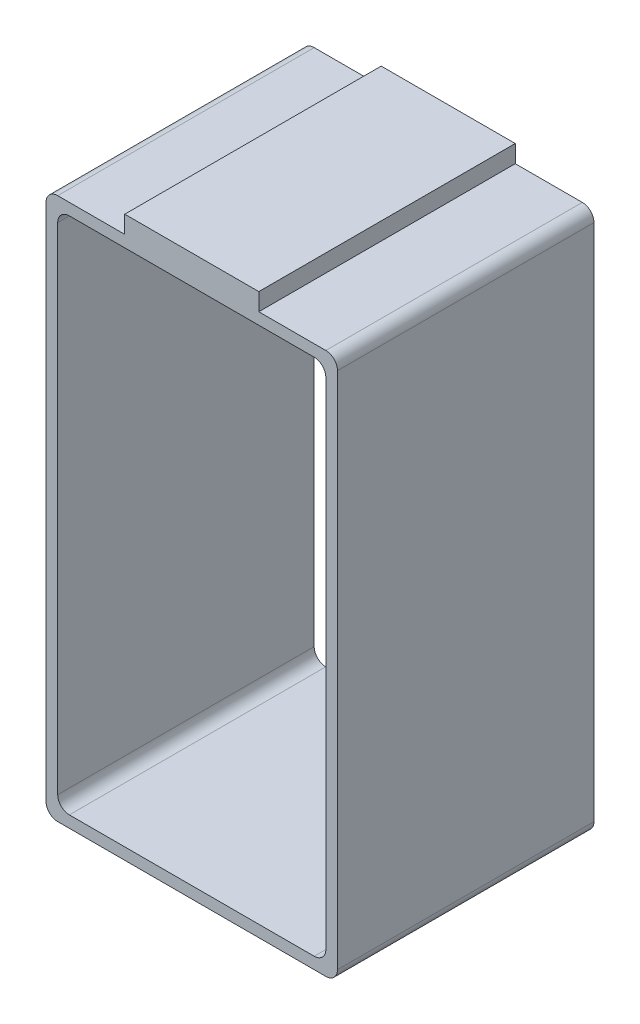
ISO-10303-21;
HEADER;
FILE_DESCRIPTION(('STEP AP214'),'2;1');
FILE_NAME('part.step','',(''),(''),'','','');
FILE_SCHEMA(('AUTOMOTIVE_DESIGN { 1 0 10303 214 1 1 1 1 }'));
ENDSEC;
DATA;
#1=APPLICATION_CONTEXT('core data for automotive mechanical design processes');
#2=APPLICATION_PROTOCOL_DEFINITION('international standard','automotive_design',2000,#1);
#3=PRODUCT_CONTEXT('',#1,'mechanical');
#4=PRODUCT('Part','Part','',(#3));
#5=PRODUCT_RELATED_PRODUCT_CATEGORY('part','',(#4));
#6=PRODUCT_DEFINITION_FORMATION('','',#4);
#7=PRODUCT_DEFINITION_CONTEXT('part definition',#1,'design');
#8=PRODUCT_DEFINITION('design','',#6,#7);
#9=PRODUCT_DEFINITION_SHAPE('','',#8);
#10=(LENGTH_UNIT() NAMED_UNIT(*) SI_UNIT(.MILLI.,.METRE.));
#11=(NAMED_UNIT(*) PLANE_ANGLE_UNIT() SI_UNIT($,.RADIAN.));
#12=(NAMED_UNIT(*) SI_UNIT($,.STERADIAN.) SOLID_ANGLE_UNIT());
#13=UNCERTAINTY_MEASURE_WITH_UNIT(LENGTH_MEASURE(1.E-05),#10,'distance_accuracy_value','');
#14=(GEOMETRIC_REPRESENTATION_CONTEXT(3) GLOBAL_UNCERTAINTY_ASSIGNED_CONTEXT((#13)) GLOBAL_UNIT_ASSIGNED_CONTEXT((#10,
#11,#12)) REPRESENTATION_CONTEXT('',''));
#15=CARTESIAN_POINT('',(0.,0.,0.));
#16=DIRECTION('',(0.,0.,1.));
#17=DIRECTION('',(1.,0.,0.));
#18=AXIS2_PLACEMENT_3D('',#15,#16,#17);
#19=CARTESIAN_POINT('',(24.,-45.5,22.));
#20=DIRECTION('',(0.,0.,-1.));
#21=DIRECTION('',(-1.,0.,0.));
#22=AXIS2_PLACEMENT_3D('',#19,#20,#21);
#23=CYLINDRICAL_SURFACE('',#22,1.);
#24=CARTESIAN_POINT('',(24.,-45.5,0.));
#25=DIRECTION('',(0.,0.,1.));
#26=DIRECTION('',(1.,0.,0.));
#27=AXIS2_PLACEMENT_3D('',#24,#25,#26);
#28=CIRCLE('',#27,1.);
#29=CARTESIAN_POINT('',(24.,-46.5,0.));
#30=VERTEX_POINT('',#29);
#31=CARTESIAN_POINT('',(25.,-45.5,0.));
#32=VERTEX_POINT('',#31);
#33=EDGE_CURVE('E230',#30,#32,#28,.T.);
#34=ORIENTED_EDGE('',*,*,#33,.T.);
#35=DIRECTION('',(0.,0.,-1.));
#36=VECTOR('',#35,1.);
#37=CARTESIAN_POINT('',(25.,-45.5,22.));
#38=LINE('',#37,#36);
#39=CARTESIAN_POINT('',(25.,-45.5,22.));
#40=VERTEX_POINT('',#39);
#41=EDGE_CURVE('E11',#40,#32,#38,.T.);
#42=ORIENTED_EDGE('',*,*,#41,.F.);
#43=CARTESIAN_POINT('',(24.,-45.5,22.));
#44=DIRECTION('',(0.,0.,1.));
#45=DIRECTION('',(1.,0.,0.));
#46=AXIS2_PLACEMENT_3D('',#43,#44,#45);
#47=CIRCLE('',#46,1.);
#48=CARTESIAN_POINT('',(24.,-46.5,22.));
#49=VERTEX_POINT('',#48);
#50=EDGE_CURVE('E242',#49,#40,#47,.T.);
#51=ORIENTED_EDGE('',*,*,#50,.F.);
#52=DIRECTION('',(0.,0.,-1.));
#53=VECTOR('',#52,1.);
#54=CARTESIAN_POINT('',(24.,-46.5,22.));
#55=LINE('',#54,#53);
#56=EDGE_CURVE('E268',#49,#30,#55,.T.);
#57=ORIENTED_EDGE('',*,*,#56,.T.);
#58=EDGE_LOOP('',(#34,#42,#51,#57));
#59=FACE_BOUND('',#58,.T.);
#60=ADVANCED_FACE('F37',(#59),#23,.T.);
#61=CARTESIAN_POINT('',(25.,-1.00000000000001,22.));
#62=DIRECTION('',(-1.,0.,0.));
#63=DIRECTION('',(0.,-1.,0.));
#64=AXIS2_PLACEMENT_3D('',#61,#62,#63);
#65=PLANE('',#64);
#66=DIRECTION('',(0.,1.,0.));
#67=VECTOR('',#66,1.);
#68=CARTESIAN_POINT('',(25.,-1.00000000000001,0.));
#69=LINE('',#68,#67);
#70=CARTESIAN_POINT('',(25.,-1.00000000000001,0.));
#71=VERTEX_POINT('',#70);
#72=EDGE_CURVE('E271',#32,#71,#69,.T.);
#73=ORIENTED_EDGE('',*,*,#72,.T.);
#74=DIRECTION('',(0.,0.,-1.));
#75=VECTOR('',#74,1.);
#76=CARTESIAN_POINT('',(25.,-1.00000000000001,22.));
#77=LINE('',#76,#75);
#78=CARTESIAN_POINT('',(25.,-1.00000000000001,22.));
#79=VERTEX_POINT('',#78);
#80=EDGE_CURVE('E44',#79,#71,#77,.T.);
#81=ORIENTED_EDGE('',*,*,#80,.F.);
#82=DIRECTION('',(0.,1.,0.));
#83=VECTOR('',#82,1.);
#84=CARTESIAN_POINT('',(25.,-1.00000000000001,22.));
#85=LINE('',#84,#83);
#86=EDGE_CURVE('E245',#40,#79,#85,.T.);
#87=ORIENTED_EDGE('',*,*,#86,.F.);
#88=ORIENTED_EDGE('',*,*,#41,.T.);
#89=EDGE_LOOP('',(#73,#81,#87,#88));
#90=FACE_BOUND('',#89,.T.);
#91=ADVANCED_FACE('F346',(#90),#65,.F.);
#92=CARTESIAN_POINT('',(24.,-1.,22.));
#93=DIRECTION('',(0.,0.,-1.));
#94=DIRECTION('',(-1.,0.,0.));
#95=AXIS2_PLACEMENT_3D('',#92,#93,#94);
#96=CYLINDRICAL_SURFACE('',#95,1.);
#97=CARTESIAN_POINT('',(24.,-1.,0.));
#98=DIRECTION('',(0.,0.,1.));
#99=DIRECTION('',(1.,0.,0.));
#100=AXIS2_PLACEMENT_3D('',#97,#98,#99);
#101=CIRCLE('',#100,1.);
#102=CARTESIAN_POINT('',(24.,0.,0.));
#103=VERTEX_POINT('',#102);
#104=EDGE_CURVE('E273',#71,#103,#101,.T.);
#105=ORIENTED_EDGE('',*,*,#104,.T.);
#106=DIRECTION('',(0.,0.,-1.));
#107=VECTOR('',#106,1.);
#108=CARTESIAN_POINT('',(24.,0.,22.));
#109=LINE('',#108,#107);
#110=CARTESIAN_POINT('',(24.,0.,22.));
#111=VERTEX_POINT('',#110);
#112=EDGE_CURVE('E318',#111,#103,#109,.T.);
#113=ORIENTED_EDGE('',*,*,#112,.F.);
#114=CARTESIAN_POINT('',(24.,-1.,22.));
#115=DIRECTION('',(0.,0.,1.));
#116=DIRECTION('',(1.,0.,0.));
#117=AXIS2_PLACEMENT_3D('',#114,#115,#116);
#118=CIRCLE('',#117,1.);
#119=EDGE_CURVE('E248',#79,#111,#118,.T.);
#120=ORIENTED_EDGE('',*,*,#119,.F.);
#121=ORIENTED_EDGE('',*,*,#80,.T.);
#122=EDGE_LOOP('',(#105,#113,#120,#121));
#123=FACE_BOUND('',#122,.T.);
#124=ADVANCED_FACE('F325',(#123),#96,.T.);
#125=CARTESIAN_POINT('',(18.25,0.,22.));
#126=DIRECTION('',(0.,-1.,0.));
#127=DIRECTION('',(0.,0.,-1.));
#128=AXIS2_PLACEMENT_3D('',#125,#126,#127);
#129=PLANE('',#128);
#130=DIRECTION('',(-1.,0.,0.));
#131=VECTOR('',#130,1.);
#132=CARTESIAN_POINT('',(18.25,0.,0.));
#133=LINE('',#132,#131);
#134=CARTESIAN_POINT('',(18.25,0.,0.));
#135=VERTEX_POINT('',#134);
#136=EDGE_CURVE('E275',#103,#135,#133,.T.);
#137=ORIENTED_EDGE('',*,*,#136,.T.);
#138=DIRECTION('',(0.,0.,-1.));
#139=VECTOR('',#138,1.);
#140=CARTESIAN_POINT('',(18.25,0.,22.));
#141=LINE('',#140,#139);
#142=CARTESIAN_POINT('',(18.25,0.,22.));
#143=VERTEX_POINT('',#142);
#144=EDGE_CURVE('E315',#143,#135,#141,.T.);
#145=ORIENTED_EDGE('',*,*,#144,.F.);
#146=DIRECTION('',(-1.,0.,0.));
#147=VECTOR('',#146,1.);
#148=CARTESIAN_POINT('',(18.25,0.,22.));
#149=LINE('',#148,#147);
#150=EDGE_CURVE('E250',#111,#143,#149,.T.);
#151=ORIENTED_EDGE('',*,*,#150,.F.);
#152=ORIENTED_EDGE('',*,*,#112,.T.);
#153=EDGE_LOOP('',(#137,#145,#151,#152));
#154=FACE_BOUND('',#153,.T.);
#155=ADVANCED_FACE('F334',(#154),#129,.F.);
#156=CARTESIAN_POINT('',(18.25,1.5,22.));
#157=DIRECTION('',(-1.,0.,0.));
#158=DIRECTION('',(0.,0.,1.));
#159=AXIS2_PLACEMENT_3D('',#156,#157,#158);
#160=PLANE('',#159);
#161=DIRECTION('',(0.,1.,0.));
#162=VECTOR('',#161,1.);
#163=CARTESIAN_POINT('',(18.25,1.5,0.));
#164=LINE('',#163,#162);
#165=CARTESIAN_POINT('',(18.25,1.5,0.));
#166=VERTEX_POINT('',#165);
#167=EDGE_CURVE('E277',#135,#166,#164,.T.);
#168=ORIENTED_EDGE('',*,*,#167,.T.);
#169=DIRECTION('',(0.,0.,-1.));
#170=VECTOR('',#169,1.);
#171=CARTESIAN_POINT('',(18.25,1.5,22.));
#172=LINE('',#171,#170);
#173=CARTESIAN_POINT('',(18.25,1.5,22.));
#174=VERTEX_POINT('',#173);
#175=EDGE_CURVE('E312',#174,#166,#172,.T.);
#176=ORIENTED_EDGE('',*,*,#175,.F.);
#177=DIRECTION('',(0.,1.,0.));
#178=VECTOR('',#177,1.);
#179=CARTESIAN_POINT('',(18.25,1.5,22.));
#180=LINE('',#179,#178);
#181=EDGE_CURVE('E252',#143,#174,#180,.T.);
#182=ORIENTED_EDGE('',*,*,#181,.F.);
#183=ORIENTED_EDGE('',*,*,#144,.T.);
#184=EDGE_LOOP('',(#168,#176,#182,#183));
#185=FACE_BOUND('',#184,.T.);
#186=ADVANCED_FACE('F338',(#185),#160,.F.);
#187=CARTESIAN_POINT('',(6.75,1.5,22.));
#188=DIRECTION('',(0.,-1.,0.));
#189=DIRECTION('',(0.,0.,-1.));
#190=AXIS2_PLACEMENT_3D('',#187,#188,#189);
#191=PLANE('',#190);
#192=DIRECTION('',(-1.,0.,0.));
#193=VECTOR('',#192,1.);
#194=CARTESIAN_POINT('',(6.75,1.5,0.));
#195=LINE('',#194,#193);
#196=CARTESIAN_POINT('',(6.75,1.5,0.));
#197=VERTEX_POINT('',#196);
#198=EDGE_CURVE('E279',#166,#197,#195,.T.);
#199=ORIENTED_EDGE('',*,*,#198,.T.);
#200=DIRECTION('',(0.,0.,-1.));
#201=VECTOR('',#200,1.);
#202=CARTESIAN_POINT('',(6.75,1.5,22.));
#203=LINE('',#202,#201);
#204=CARTESIAN_POINT('',(6.75,1.5,22.));
#205=VERTEX_POINT('',#204);
#206=EDGE_CURVE('E309',#205,#197,#203,.T.);
#207=ORIENTED_EDGE('',*,*,#206,.F.);
#208=DIRECTION('',(-1.,0.,0.));
#209=VECTOR('',#208,1.);
#210=CARTESIAN_POINT('',(6.75,1.5,22.));
#211=LINE('',#210,#209);
#212=EDGE_CURVE('E254',#174,#205,#211,.T.);
#213=ORIENTED_EDGE('',*,*,#212,.F.);
#214=ORIENTED_EDGE('',*,*,#175,.T.);
#215=EDGE_LOOP('',(#199,#207,#213,#214));
#216=FACE_BOUND('',#215,.T.);
#217=ADVANCED_FACE('F379',(#216),#191,.F.);
#218=CARTESIAN_POINT('',(6.75,1.5,22.));
#219=DIRECTION('',(1.,0.,0.));
#220=DIRECTION('',(0.,0.,-1.));
#221=AXIS2_PLACEMENT_3D('',#218,#219,#220);
#222=PLANE('',#221);
#223=DIRECTION('',(0.,-1.,0.));
#224=VECTOR('',#223,1.);
#225=CARTESIAN_POINT('',(6.75,1.5,0.));
#226=LINE('',#225,#224);
#227=CARTESIAN_POINT('',(6.75,0.,0.));
#228=VERTEX_POINT('',#227);
#229=EDGE_CURVE('E281',#197,#228,#226,.T.);
#230=ORIENTED_EDGE('',*,*,#229,.T.);
#231=DIRECTION('',(0.,0.,-1.));
#232=VECTOR('',#231,1.);
#233=CARTESIAN_POINT('',(6.75,0.,22.));
#234=LINE('',#233,#232);
#235=CARTESIAN_POINT('',(6.75,0.,22.));
#236=VERTEX_POINT('',#235);
#237=EDGE_CURVE('E306',#236,#228,#234,.T.);
#238=ORIENTED_EDGE('',*,*,#237,.F.);
#239=DIRECTION('',(0.,-1.,0.));
#240=VECTOR('',#239,1.);
#241=CARTESIAN_POINT('',(6.75,1.5,22.));
#242=LINE('',#241,#240);
#243=EDGE_CURVE('E256',#205,#236,#242,.T.);
#244=ORIENTED_EDGE('',*,*,#243,.F.);
#245=ORIENTED_EDGE('',*,*,#206,.T.);
#246=EDGE_LOOP('',(#230,#238,#244,#245));
#247=FACE_BOUND('',#246,.T.);
#248=ADVANCED_FACE('F377',(#247),#222,.F.);
#249=CARTESIAN_POINT('',(1.00000000000001,0.,22.));
#250=DIRECTION('',(0.,-1.,0.));
#251=DIRECTION('',(0.,0.,-1.));
#252=AXIS2_PLACEMENT_3D('',#249,#250,#251);
#253=PLANE('',#252);
#254=DIRECTION('',(-1.,0.,0.));
#255=VECTOR('',#254,1.);
#256=CARTESIAN_POINT('',(1.00000000000001,0.,0.));
#257=LINE('',#256,#255);
#258=CARTESIAN_POINT('',(1.00000000000001,0.,0.));
#259=VERTEX_POINT('',#258);
#260=EDGE_CURVE('E283',#228,#259,#257,.T.);
#261=ORIENTED_EDGE('',*,*,#260,.T.);
#262=DIRECTION('',(0.,0.,-1.));
#263=VECTOR('',#262,1.);
#264=CARTESIAN_POINT('',(1.00000000000001,0.,22.));
#265=LINE('',#264,#263);
#266=CARTESIAN_POINT('',(1.00000000000001,0.,22.));
#267=VERTEX_POINT('',#266);
#268=EDGE_CURVE('E303',#267,#259,#265,.T.);
#269=ORIENTED_EDGE('',*,*,#268,.F.);
#270=DIRECTION('',(-1.,0.,0.));
#271=VECTOR('',#270,1.);
#272=CARTESIAN_POINT('',(1.00000000000001,0.,22.));
#273=LINE('',#272,#271);
#274=EDGE_CURVE('E258',#236,#267,#273,.T.);
#275=ORIENTED_EDGE('',*,*,#274,.F.);
#276=ORIENTED_EDGE('',*,*,#237,.T.);
#277=EDGE_LOOP('',(#261,#269,#275,#276));
#278=FACE_BOUND('',#277,.T.);
#279=ADVANCED_FACE('F373',(#278),#253,.F.);
#280=CARTESIAN_POINT('',(1.,-1.,22.));
#281=DIRECTION('',(0.,0.,-1.));
#282=DIRECTION('',(-1.,0.,0.));
#283=AXIS2_PLACEMENT_3D('',#280,#281,#282);
#284=CYLINDRICAL_SURFACE('',#283,1.);
#285=CARTESIAN_POINT('',(1.,-1.,0.));
#286=DIRECTION('',(0.,0.,1.));
#287=DIRECTION('',(-1.,0.,0.));
#288=AXIS2_PLACEMENT_3D('',#285,#286,#287);
#289=CIRCLE('',#288,1.);
#290=CARTESIAN_POINT('',(0.,-1.00000000000001,0.));
#291=VERTEX_POINT('',#290);
#292=EDGE_CURVE('E285',#259,#291,#289,.T.);
#293=ORIENTED_EDGE('',*,*,#292,.T.);
#294=DIRECTION('',(0.,0.,-1.));
#295=VECTOR('',#294,1.);
#296=CARTESIAN_POINT('',(0.,-1.00000000000001,22.));
#297=LINE('',#296,#295);
#298=CARTESIAN_POINT('',(0.,-1.00000000000001,22.));
#299=VERTEX_POINT('',#298);
#300=EDGE_CURVE('E300',#299,#291,#297,.T.);
#301=ORIENTED_EDGE('',*,*,#300,.F.);
#302=CARTESIAN_POINT('',(1.,-1.,22.));
#303=DIRECTION('',(0.,0.,1.));
#304=DIRECTION('',(-1.,0.,0.));
#305=AXIS2_PLACEMENT_3D('',#302,#303,#304);
#306=CIRCLE('',#305,1.);
#307=EDGE_CURVE('E260',#267,#299,#306,.T.);
#308=ORIENTED_EDGE('',*,*,#307,.F.);
#309=ORIENTED_EDGE('',*,*,#268,.T.);
#310=EDGE_LOOP('',(#293,#301,#308,#309));
#311=FACE_BOUND('',#310,.T.);
#312=ADVANCED_FACE('F368',(#311),#284,.T.);
#313=CARTESIAN_POINT('',(0.,-1.00000000000001,22.));
#314=DIRECTION('',(1.,0.,0.));
#315=DIRECTION('',(0.,1.,0.));
#316=AXIS2_PLACEMENT_3D('',#313,#314,#315);
#317=PLANE('',#316);
#318=DIRECTION('',(0.,-1.,0.));
#319=VECTOR('',#318,1.);
#320=CARTESIAN_POINT('',(0.,-1.00000000000001,0.));
#321=LINE('',#320,#319);
#322=CARTESIAN_POINT('',(0.,-45.5,0.));
#323=VERTEX_POINT('',#322);
#324=EDGE_CURVE('E287',#291,#323,#321,.T.);
#325=ORIENTED_EDGE('',*,*,#324,.T.);
#326=DIRECTION('',(0.,0.,-1.));
#327=VECTOR('',#326,1.);
#328=CARTESIAN_POINT('',(0.,-45.5,22.));
#329=LINE('',#328,#327);
#330=CARTESIAN_POINT('',(0.,-45.5,22.));
#331=VERTEX_POINT('',#330);
#332=EDGE_CURVE('E297',#331,#323,#329,.T.);
#333=ORIENTED_EDGE('',*,*,#332,.F.);
#334=DIRECTION('',(0.,-1.,0.));
#335=VECTOR('',#334,1.);
#336=CARTESIAN_POINT('',(0.,-1.00000000000001,22.));
#337=LINE('',#336,#335);
#338=EDGE_CURVE('E262',#299,#331,#337,.T.);
#339=ORIENTED_EDGE('',*,*,#338,.F.);
#340=ORIENTED_EDGE('',*,*,#300,.T.);
#341=EDGE_LOOP('',(#325,#333,#339,#340));
#342=FACE_BOUND('',#341,.T.);
#343=ADVANCED_FACE('F362',(#342),#317,.F.);
#344=CARTESIAN_POINT('',(1.00000000000001,-45.5,22.));
#345=DIRECTION('',(0.,0.,-1.));
#346=DIRECTION('',(-1.,0.,0.));
#347=AXIS2_PLACEMENT_3D('',#344,#345,#346);
#348=CYLINDRICAL_SURFACE('',#347,1.);
#349=CARTESIAN_POINT('',(1.00000000000001,-45.5,0.));
#350=DIRECTION('',(0.,0.,1.));
#351=DIRECTION('',(-1.,0.,0.));
#352=AXIS2_PLACEMENT_3D('',#349,#350,#351);
#353=CIRCLE('',#352,1.);
#354=CARTESIAN_POINT('',(1.00000000000001,-46.5,0.));
#355=VERTEX_POINT('',#354);
#356=EDGE_CURVE('E289',#323,#355,#353,.T.);
#357=ORIENTED_EDGE('',*,*,#356,.T.);
#358=DIRECTION('',(0.,0.,-1.));
#359=VECTOR('',#358,1.);
#360=CARTESIAN_POINT('',(1.00000000000001,-46.5,22.));
#361=LINE('',#360,#359);
#362=CARTESIAN_POINT('',(1.00000000000001,-46.5,22.));
#363=VERTEX_POINT('',#362);
#364=EDGE_CURVE('E294',#363,#355,#361,.T.);
#365=ORIENTED_EDGE('',*,*,#364,.F.);
#366=CARTESIAN_POINT('',(1.00000000000001,-45.5,22.));
#367=DIRECTION('',(0.,0.,1.));
#368=DIRECTION('',(-1.,0.,0.));
#369=AXIS2_PLACEMENT_3D('',#366,#367,#368);
#370=CIRCLE('',#369,1.);
#371=EDGE_CURVE('E264',#331,#363,#370,.T.);
#372=ORIENTED_EDGE('',*,*,#371,.F.);
#373=ORIENTED_EDGE('',*,*,#332,.T.);
#374=EDGE_LOOP('',(#357,#365,#372,#373));
#375=FACE_BOUND('',#374,.T.);
#376=ADVANCED_FACE('F358',(#375),#348,.T.);
#377=CARTESIAN_POINT('',(1.00000000000001,-46.5,22.));
#378=DIRECTION('',(0.,1.,0.));
#379=DIRECTION('',(0.,0.,1.));
#380=AXIS2_PLACEMENT_3D('',#377,#378,#379);
#381=PLANE('',#380);
#382=DIRECTION('',(1.,0.,0.));
#383=VECTOR('',#382,1.);
#384=CARTESIAN_POINT('',(1.00000000000001,-46.5,0.));
#385=LINE('',#384,#383);
#386=EDGE_CURVE('E246',#355,#30,#385,.T.);
#387=ORIENTED_EDGE('',*,*,#386,.T.);
#388=ORIENTED_EDGE('',*,*,#56,.F.);
#389=DIRECTION('',(1.,0.,0.));
#390=VECTOR('',#389,1.);
#391=CARTESIAN_POINT('',(1.00000000000001,-46.5,22.));
#392=LINE('',#391,#390);
#393=EDGE_CURVE('E266',#363,#49,#392,.T.);
#394=ORIENTED_EDGE('',*,*,#393,.F.);
#395=ORIENTED_EDGE('',*,*,#364,.T.);
#396=EDGE_LOOP('',(#387,#388,#394,#395));
#397=FACE_BOUND('',#396,.T.);
#398=ADVANCED_FACE('F353',(#397),#381,.F.);
#399=CARTESIAN_POINT('',(24.,-45.5,22.));
#400=DIRECTION('',(0.,0.,1.));
#401=DIRECTION('',(1.,0.,0.));
#402=AXIS2_PLACEMENT_3D('',#399,#400,#401);
#403=PLANE('',#402);
#404=CARTESIAN_POINT('',(2.00000000000001,-44.5,22.));
#405=DIRECTION('',(0.,0.,1.));
#406=DIRECTION('',(-1.,0.,0.));
#407=AXIS2_PLACEMENT_3D('',#404,#405,#406);
#408=CIRCLE('',#407,1.);
#409=CARTESIAN_POINT('',(1.00000000000001,-44.5,22.));
#410=VERTEX_POINT('',#409);
#411=CARTESIAN_POINT('',(2.00000000000002,-45.5,22.));
#412=VERTEX_POINT('',#411);
#413=EDGE_CURVE('E51',#410,#412,#408,.T.);
#414=ORIENTED_EDGE('',*,*,#413,.F.);
#415=DIRECTION('',(0.,-1.,0.));
#416=VECTOR('',#415,1.);
#417=CARTESIAN_POINT('',(1.00000000000001,-2.00000000000001,22.));
#418=LINE('',#417,#416);
#419=CARTESIAN_POINT('',(1.00000000000001,-2.00000000000001,22.));
#420=VERTEX_POINT('',#419);
#421=EDGE_CURVE('E192',#420,#410,#418,.T.);
#422=ORIENTED_EDGE('',*,*,#421,.F.);
#423=CARTESIAN_POINT('',(2.00000000000001,-2.,22.));
#424=DIRECTION('',(0.,0.,1.));
#425=DIRECTION('',(-1.,0.,0.));
#426=AXIS2_PLACEMENT_3D('',#423,#424,#425);
#427=CIRCLE('',#426,1.);
#428=CARTESIAN_POINT('',(2.00000000000001,-1.,22.));
#429=VERTEX_POINT('',#428);
#430=EDGE_CURVE('E195',#429,#420,#427,.T.);
#431=ORIENTED_EDGE('',*,*,#430,.F.);
#432=DIRECTION('',(-1.,0.,0.));
#433=VECTOR('',#432,1.);
#434=CARTESIAN_POINT('',(2.00000000000001,-1.,22.));
#435=LINE('',#434,#433);
#436=CARTESIAN_POINT('',(23.,-1.,22.));
#437=VERTEX_POINT('',#436);
#438=EDGE_CURVE('E223',#437,#429,#435,.T.);
#439=ORIENTED_EDGE('',*,*,#438,.F.);
#440=CARTESIAN_POINT('',(23.,-2.,22.));
#441=DIRECTION('',(0.,0.,1.));
#442=DIRECTION('',(1.,0.,0.));
#443=AXIS2_PLACEMENT_3D('',#440,#441,#442);
#444=CIRCLE('',#443,1.);
#445=CARTESIAN_POINT('',(24.,-2.00000000000001,22.));
#446=VERTEX_POINT('',#445);
#447=EDGE_CURVE('E220',#446,#437,#444,.T.);
#448=ORIENTED_EDGE('',*,*,#447,.F.);
#449=DIRECTION('',(0.,1.,0.));
#450=VECTOR('',#449,1.);
#451=CARTESIAN_POINT('',(24.,-2.00000000000001,22.));
#452=LINE('',#451,#450);
#453=CARTESIAN_POINT('',(24.,-44.5,22.));
#454=VERTEX_POINT('',#453);
#455=EDGE_CURVE('E217',#454,#446,#452,.T.);
#456=ORIENTED_EDGE('',*,*,#455,.F.);
#457=CARTESIAN_POINT('',(23.,-44.5,22.));
#458=DIRECTION('',(0.,0.,1.));
#459=DIRECTION('',(1.,0.,0.));
#460=AXIS2_PLACEMENT_3D('',#457,#458,#459);
#461=CIRCLE('',#460,1.);
#462=CARTESIAN_POINT('',(23.,-45.5,22.));
#463=VERTEX_POINT('',#462);
#464=EDGE_CURVE('E214',#463,#454,#461,.T.);
#465=ORIENTED_EDGE('',*,*,#464,.F.);
#466=DIRECTION('',(1.,0.,0.));
#467=VECTOR('',#466,1.);
#468=CARTESIAN_POINT('',(2.00000000000001,-45.5,22.));
#469=LINE('',#468,#467);
#470=EDGE_CURVE('E212',#412,#463,#469,.T.);
#471=ORIENTED_EDGE('',*,*,#470,.F.);
#472=EDGE_LOOP('',(#414,#422,#431,#439,#448,#456,#465,#471));
#473=FACE_BOUND('',#472,.T.);
#474=ORIENTED_EDGE('',*,*,#50,.T.);
#475=ORIENTED_EDGE('',*,*,#86,.T.);
#476=ORIENTED_EDGE('',*,*,#119,.T.);
#477=ORIENTED_EDGE('',*,*,#150,.T.);
#478=ORIENTED_EDGE('',*,*,#181,.T.);
#479=ORIENTED_EDGE('',*,*,#212,.T.);
#480=ORIENTED_EDGE('',*,*,#243,.T.);
#481=ORIENTED_EDGE('',*,*,#274,.T.);
#482=ORIENTED_EDGE('',*,*,#307,.T.);
#483=ORIENTED_EDGE('',*,*,#338,.T.);
#484=ORIENTED_EDGE('',*,*,#371,.T.);
#485=ORIENTED_EDGE('',*,*,#393,.T.);
#486=EDGE_LOOP('',(#474,#475,#476,#477,#478,#479,#480,#481,#482,#483,#484,#485));
#487=FACE_BOUND('',#486,.T.);
#488=ADVANCED_FACE('F342',(#473,#487),#403,.T.);
#489=CARTESIAN_POINT('',(24.,-45.5,0.));
#490=DIRECTION('',(0.,0.,1.));
#491=DIRECTION('',(1.,0.,0.));
#492=AXIS2_PLACEMENT_3D('',#489,#490,#491);
#493=PLANE('',#492);
#494=DIRECTION('',(0.,-1.,0.));
#495=VECTOR('',#494,1.);
#496=CARTESIAN_POINT('',(1.00000000000001,-2.00000000000001,0.));
#497=LINE('',#496,#495);
#498=CARTESIAN_POINT('',(1.00000000000001,-2.00000000000001,0.));
#499=VERTEX_POINT('',#498);
#500=CARTESIAN_POINT('',(1.00000000000001,-44.5,0.));
#501=VERTEX_POINT('',#500);
#502=EDGE_CURVE('E181',#499,#501,#497,.T.);
#503=ORIENTED_EDGE('',*,*,#502,.T.);
#504=CARTESIAN_POINT('',(2.00000000000001,-44.5,0.));
#505=DIRECTION('',(0.,0.,1.));
#506=DIRECTION('',(-1.,0.,0.));
#507=AXIS2_PLACEMENT_3D('',#504,#505,#506);
#508=CIRCLE('',#507,1.);
#509=CARTESIAN_POINT('',(2.00000000000001,-45.5,0.));
#510=VERTEX_POINT('',#509);
#511=EDGE_CURVE('E175',#501,#510,#508,.T.);
#512=ORIENTED_EDGE('',*,*,#511,.T.);
#513=DIRECTION('',(1.,0.,0.));
#514=VECTOR('',#513,1.);
#515=CARTESIAN_POINT('',(2.00000000000001,-45.5,0.));
#516=LINE('',#515,#514);
#517=CARTESIAN_POINT('',(23.,-45.5,0.));
#518=VERTEX_POINT('',#517);
#519=EDGE_CURVE('E184',#510,#518,#516,.T.);
#520=ORIENTED_EDGE('',*,*,#519,.T.);
#521=CARTESIAN_POINT('',(23.,-44.5,0.));
#522=DIRECTION('',(0.,0.,1.));
#523=DIRECTION('',(1.,0.,0.));
#524=AXIS2_PLACEMENT_3D('',#521,#522,#523);
#525=CIRCLE('',#524,1.);
#526=CARTESIAN_POINT('',(24.,-44.5,0.));
#527=VERTEX_POINT('',#526);
#528=EDGE_CURVE('E59',#518,#527,#525,.T.);
#529=ORIENTED_EDGE('',*,*,#528,.T.);
#530=DIRECTION('',(0.,1.,0.));
#531=VECTOR('',#530,1.);
#532=CARTESIAN_POINT('',(24.,-2.00000000000001,0.));
#533=LINE('',#532,#531);
#534=CARTESIAN_POINT('',(24.,-2.00000000000001,0.));
#535=VERTEX_POINT('',#534);
#536=EDGE_CURVE('E199',#527,#535,#533,.T.);
#537=ORIENTED_EDGE('',*,*,#536,.T.);
#538=CARTESIAN_POINT('',(23.,-2.,0.));
#539=DIRECTION('',(0.,0.,1.));
#540=DIRECTION('',(1.,0.,0.));
#541=AXIS2_PLACEMENT_3D('',#538,#539,#540);
#542=CIRCLE('',#541,1.);
#543=CARTESIAN_POINT('',(23.,-1.,0.));
#544=VERTEX_POINT('',#543);
#545=EDGE_CURVE('E202',#535,#544,#542,.T.);
#546=ORIENTED_EDGE('',*,*,#545,.T.);
#547=DIRECTION('',(-1.,0.,0.));
#548=VECTOR('',#547,1.);
#549=CARTESIAN_POINT('',(2.00000000000001,-1.,0.));
#550=LINE('',#549,#548);
#551=CARTESIAN_POINT('',(2.00000000000001,-1.,0.));
#552=VERTEX_POINT('',#551);
#553=EDGE_CURVE('E205',#544,#552,#550,.T.);
#554=ORIENTED_EDGE('',*,*,#553,.T.);
#555=CARTESIAN_POINT('',(2.00000000000001,-2.,0.));
#556=DIRECTION('',(0.,0.,1.));
#557=DIRECTION('',(-1.,0.,0.));
#558=AXIS2_PLACEMENT_3D('',#555,#556,#557);
#559=CIRCLE('',#558,1.);
#560=EDGE_CURVE('E208',#552,#499,#559,.T.);
#561=ORIENTED_EDGE('',*,*,#560,.T.);
#562=EDGE_LOOP('',(#503,#512,#520,#529,#537,#546,#554,#561));
#563=FACE_BOUND('',#562,.T.);
#564=ORIENTED_EDGE('',*,*,#33,.F.);
#565=ORIENTED_EDGE('',*,*,#386,.F.);
#566=ORIENTED_EDGE('',*,*,#356,.F.);
#567=ORIENTED_EDGE('',*,*,#324,.F.);
#568=ORIENTED_EDGE('',*,*,#292,.F.);
#569=ORIENTED_EDGE('',*,*,#260,.F.);
#570=ORIENTED_EDGE('',*,*,#229,.F.);
#571=ORIENTED_EDGE('',*,*,#198,.F.);
#572=ORIENTED_EDGE('',*,*,#167,.F.);
#573=ORIENTED_EDGE('',*,*,#136,.F.);
#574=ORIENTED_EDGE('',*,*,#104,.F.);
#575=ORIENTED_EDGE('',*,*,#72,.F.);
#576=EDGE_LOOP('',(#564,#565,#566,#567,#568,#569,#570,#571,#572,#573,#574,#575));
#577=FACE_BOUND('',#576,.T.);
#578=ADVANCED_FACE('F188',(#563,#577),#493,.F.);
#579=CARTESIAN_POINT('',(2.00000000000001,-44.5,0.));
#580=DIRECTION('',(0.,0.,1.));
#581=DIRECTION('',(1.,0.,0.));
#582=AXIS2_PLACEMENT_3D('',#579,#580,#581);
#583=CYLINDRICAL_SURFACE('',#582,1.);
#584=ORIENTED_EDGE('',*,*,#413,.T.);
#585=DIRECTION('',(0.,0.,1.));
#586=VECTOR('',#585,1.);
#587=CARTESIAN_POINT('',(2.00000000000001,-45.5,0.));
#588=LINE('',#587,#586);
#589=EDGE_CURVE('E171',#510,#412,#588,.T.);
#590=ORIENTED_EDGE('',*,*,#589,.F.);
#591=ORIENTED_EDGE('',*,*,#511,.F.);
#592=DIRECTION('',(0.,0.,1.));
#593=VECTOR('',#592,1.);
#594=CARTESIAN_POINT('',(1.00000000000001,-44.5,0.));
#595=LINE('',#594,#593);
#596=EDGE_CURVE('E228',#501,#410,#595,.T.);
#597=ORIENTED_EDGE('',*,*,#596,.T.);
#598=EDGE_LOOP('',(#584,#590,#591,#597));
#599=FACE_BOUND('',#598,.T.);
#600=ADVANCED_FACE('F173',(#599),#583,.F.);
#601=CARTESIAN_POINT('',(1.00000000000001,-2.00000000000001,0.));
#602=DIRECTION('',(-1.,0.,0.));
#603=DIRECTION('',(0.,0.,1.));
#604=AXIS2_PLACEMENT_3D('',#601,#602,#603);
#605=PLANE('',#604);
#606=ORIENTED_EDGE('',*,*,#421,.T.);
#607=ORIENTED_EDGE('',*,*,#596,.F.);
#608=ORIENTED_EDGE('',*,*,#502,.F.);
#609=DIRECTION('',(0.,0.,1.));
#610=VECTOR('',#609,1.);
#611=CARTESIAN_POINT('',(1.00000000000001,-2.00000000000001,0.));
#612=LINE('',#611,#610);
#613=EDGE_CURVE('E231',#499,#420,#612,.T.);
#614=ORIENTED_EDGE('',*,*,#613,.T.);
#615=EDGE_LOOP('',(#606,#607,#608,#614));
#616=FACE_BOUND('',#615,.T.);
#617=ADVANCED_FACE('F462',(#616),#605,.F.);
#618=CARTESIAN_POINT('',(2.00000000000001,-2.,0.));
#619=DIRECTION('',(0.,0.,1.));
#620=DIRECTION('',(1.,0.,0.));
#621=AXIS2_PLACEMENT_3D('',#618,#619,#620);
#622=CYLINDRICAL_SURFACE('',#621,1.);
#623=ORIENTED_EDGE('',*,*,#430,.T.);
#624=ORIENTED_EDGE('',*,*,#613,.F.);
#625=ORIENTED_EDGE('',*,*,#560,.F.);
#626=DIRECTION('',(0.,0.,1.));
#627=VECTOR('',#626,1.);
#628=CARTESIAN_POINT('',(2.00000000000001,-1.,0.));
#629=LINE('',#628,#627);
#630=EDGE_CURVE('E233',#552,#429,#629,.T.);
#631=ORIENTED_EDGE('',*,*,#630,.T.);
#632=EDGE_LOOP('',(#623,#624,#625,#631));
#633=FACE_BOUND('',#632,.T.);
#634=ADVANCED_FACE('F469',(#633),#622,.F.);
#635=CARTESIAN_POINT('',(2.00000000000001,-1.,0.));
#636=DIRECTION('',(0.,1.,0.));
#637=DIRECTION('',(0.,0.,1.));
#638=AXIS2_PLACEMENT_3D('',#635,#636,#637);
#639=PLANE('',#638);
#640=ORIENTED_EDGE('',*,*,#438,.T.);
#641=ORIENTED_EDGE('',*,*,#630,.F.);
#642=ORIENTED_EDGE('',*,*,#553,.F.);
#643=DIRECTION('',(0.,0.,1.));
#644=VECTOR('',#643,1.);
#645=CARTESIAN_POINT('',(23.,-1.,0.));
#646=LINE('',#645,#644);
#647=EDGE_CURVE('E235',#544,#437,#646,.T.);
#648=ORIENTED_EDGE('',*,*,#647,.T.);
#649=EDGE_LOOP('',(#640,#641,#642,#648));
#650=FACE_BOUND('',#649,.T.);
#651=ADVANCED_FACE('F477',(#650),#639,.F.);
#652=CARTESIAN_POINT('',(23.,-2.,0.));
#653=DIRECTION('',(0.,0.,1.));
#654=DIRECTION('',(1.,0.,0.));
#655=AXIS2_PLACEMENT_3D('',#652,#653,#654);
#656=CYLINDRICAL_SURFACE('',#655,1.);
#657=ORIENTED_EDGE('',*,*,#447,.T.);
#658=ORIENTED_EDGE('',*,*,#647,.F.);
#659=ORIENTED_EDGE('',*,*,#545,.F.);
#660=DIRECTION('',(0.,0.,1.));
#661=VECTOR('',#660,1.);
#662=CARTESIAN_POINT('',(24.,-2.00000000000001,0.));
#663=LINE('',#662,#661);
#664=EDGE_CURVE('E237',#535,#446,#663,.T.);
#665=ORIENTED_EDGE('',*,*,#664,.T.);
#666=EDGE_LOOP('',(#657,#658,#659,#665));
#667=FACE_BOUND('',#666,.T.);
#668=ADVANCED_FACE('F485',(#667),#656,.F.);
#669=CARTESIAN_POINT('',(24.,-2.00000000000001,0.));
#670=DIRECTION('',(1.,0.,0.));
#671=DIRECTION('',(0.,1.,0.));
#672=AXIS2_PLACEMENT_3D('',#669,#670,#671);
#673=PLANE('',#672);
#674=ORIENTED_EDGE('',*,*,#455,.T.);
#675=ORIENTED_EDGE('',*,*,#664,.F.);
#676=ORIENTED_EDGE('',*,*,#536,.F.);
#677=DIRECTION('',(0.,0.,1.));
#678=VECTOR('',#677,1.);
#679=CARTESIAN_POINT('',(24.,-44.5,0.));
#680=LINE('',#679,#678);
#681=EDGE_CURVE('E239',#527,#454,#680,.T.);
#682=ORIENTED_EDGE('',*,*,#681,.T.);
#683=EDGE_LOOP('',(#674,#675,#676,#682));
#684=FACE_BOUND('',#683,.T.);
#685=ADVANCED_FACE('F493',(#684),#673,.F.);
#686=CARTESIAN_POINT('',(23.,-44.5,0.));
#687=DIRECTION('',(0.,0.,1.));
#688=DIRECTION('',(1.,0.,0.));
#689=AXIS2_PLACEMENT_3D('',#686,#687,#688);
#690=CYLINDRICAL_SURFACE('',#689,1.);
#691=ORIENTED_EDGE('',*,*,#464,.T.);
#692=ORIENTED_EDGE('',*,*,#681,.F.);
#693=ORIENTED_EDGE('',*,*,#528,.F.);
#694=DIRECTION('',(0.,0.,1.));
#695=VECTOR('',#694,1.);
#696=CARTESIAN_POINT('',(23.,-45.5,0.));
#697=LINE('',#696,#695);
#698=EDGE_CURVE('E180',#518,#463,#697,.T.);
#699=ORIENTED_EDGE('',*,*,#698,.T.);
#700=EDGE_LOOP('',(#691,#692,#693,#699));
#701=FACE_BOUND('',#700,.T.);
#702=ADVANCED_FACE('F501',(#701),#690,.F.);
#703=CARTESIAN_POINT('',(2.00000000000001,-45.5,0.));
#704=DIRECTION('',(0.,-1.,0.));
#705=DIRECTION('',(1.,0.,0.));
#706=AXIS2_PLACEMENT_3D('',#703,#704,#705);
#707=PLANE('',#706);
#708=ORIENTED_EDGE('',*,*,#470,.T.);
#709=ORIENTED_EDGE('',*,*,#698,.F.);
#710=ORIENTED_EDGE('',*,*,#519,.F.);
#711=ORIENTED_EDGE('',*,*,#589,.T.);
#712=EDGE_LOOP('',(#708,#709,#710,#711));
#713=FACE_BOUND('',#712,.T.);
#714=ADVANCED_FACE('F185',(#713),#707,.F.);
#715=CLOSED_SHELL('',(#60,#91,#124,#155,#186,#217,#248,#279,#312,#343,#376,#398,#488,#578,#600,
#617,#634,#651,#668,#685,#702,#714));
#716=MANIFOLD_SOLID_BREP('B2',#715);
#717=ADVANCED_BREP_SHAPE_REPRESENTATION('',(#18,#716),#14);
#718=SHAPE_DEFINITION_REPRESENTATION(#9,#717);
ENDSEC;
END-ISO-10303-21;
